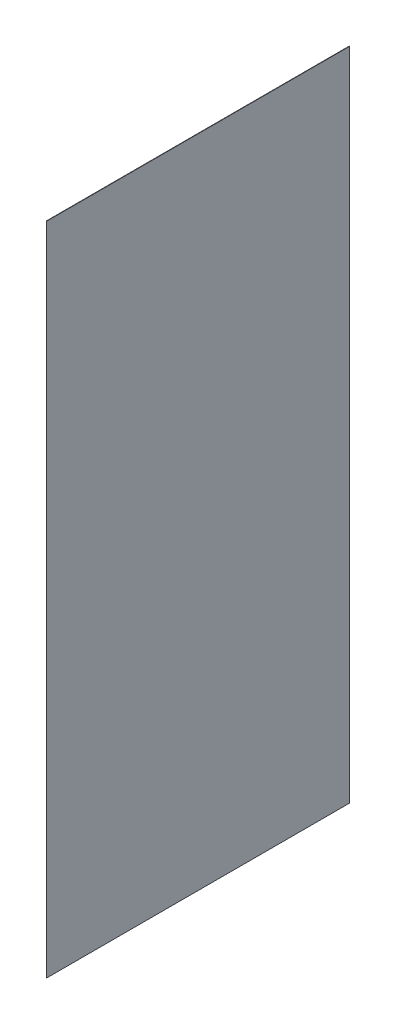
ISO-10303-21;
HEADER;
FILE_DESCRIPTION(('STEP AP214'),'2;1');
FILE_NAME('part.step','',(''),(''),'','','');
FILE_SCHEMA(('AUTOMOTIVE_DESIGN { 1 0 10303 214 1 1 1 1 }'));
ENDSEC;
DATA;
#1=APPLICATION_CONTEXT('core data for automotive mechanical design processes');
#2=APPLICATION_PROTOCOL_DEFINITION('international standard','automotive_design',2000,#1);
#3=PRODUCT_CONTEXT('',#1,'mechanical');
#4=PRODUCT('Part','Part','',(#3));
#5=PRODUCT_RELATED_PRODUCT_CATEGORY('part','',(#4));
#6=PRODUCT_DEFINITION_FORMATION('','',#4);
#7=PRODUCT_DEFINITION_CONTEXT('part definition',#1,'design');
#8=PRODUCT_DEFINITION('design','',#6,#7);
#9=PRODUCT_DEFINITION_SHAPE('','',#8);
#10=(LENGTH_UNIT() NAMED_UNIT(*) SI_UNIT(.MILLI.,.METRE.));
#11=(NAMED_UNIT(*) PLANE_ANGLE_UNIT() SI_UNIT($,.RADIAN.));
#12=(NAMED_UNIT(*) SI_UNIT($,.STERADIAN.) SOLID_ANGLE_UNIT());
#13=UNCERTAINTY_MEASURE_WITH_UNIT(LENGTH_MEASURE(1.E-05),#10,'distance_accuracy_value','');
#14=(GEOMETRIC_REPRESENTATION_CONTEXT(3) GLOBAL_UNCERTAINTY_ASSIGNED_CONTEXT((#13)) GLOBAL_UNIT_ASSIGNED_CONTEXT((#10,
#11,#12)) REPRESENTATION_CONTEXT('',''));
#15=CARTESIAN_POINT('',(0.,0.,0.));
#16=DIRECTION('',(0.,0.,1.));
#17=DIRECTION('',(1.,0.,0.));
#18=AXIS2_PLACEMENT_3D('',#15,#16,#17);
#19=CARTESIAN_POINT('',(657.5,241.5,-798.5));
#20=DIRECTION('',(-1.,0.,0.));
#21=DIRECTION('',(0.,0.,1.));
#22=AXIS2_PLACEMENT_3D('',#19,#20,#21);
#23=PLANE('',#22);
#24=DIRECTION('',(0.,-1.,0.));
#25=VECTOR('',#24,1.);
#26=CARTESIAN_POINT('',(657.5,241.5,0.));
#27=LINE('',#26,#25);
#28=CARTESIAN_POINT('',(657.5,1968.5,0.));
#29=VERTEX_POINT('',#28);
#30=CARTESIAN_POINT('',(657.5,241.5,0.));
#31=VERTEX_POINT('',#30);
#32=EDGE_CURVE('E103',#29,#31,#27,.T.);
#33=ORIENTED_EDGE('',*,*,#32,.F.);
#34=DIRECTION('',(0.,0.,1.));
#35=VECTOR('',#34,1.);
#36=CARTESIAN_POINT('',(657.5,1968.5,-798.5));
#37=LINE('',#36,#35);
#38=CARTESIAN_POINT('',(657.5,1968.5,-798.5));
#39=VERTEX_POINT('',#38);
#40=EDGE_CURVE('E11',#39,#29,#37,.T.);
#41=ORIENTED_EDGE('',*,*,#40,.F.);
#42=DIRECTION('',(0.,-1.,0.));
#43=VECTOR('',#42,1.);
#44=CARTESIAN_POINT('',(657.5,241.5,-798.5));
#45=LINE('',#44,#43);
#46=CARTESIAN_POINT('',(657.5,241.5,-798.5));
#47=VERTEX_POINT('',#46);
#48=EDGE_CURVE('E97',#39,#47,#45,.T.);
#49=ORIENTED_EDGE('',*,*,#48,.T.);
#50=DIRECTION('',(0.,0.,1.));
#51=VECTOR('',#50,1.);
#52=CARTESIAN_POINT('',(657.5,241.5,-798.5));
#53=LINE('',#52,#51);
#54=EDGE_CURVE('E42',#47,#31,#53,.T.);
#55=ORIENTED_EDGE('',*,*,#54,.T.);
#56=EDGE_LOOP('',(#33,#41,#49,#55));
#57=FACE_BOUND('',#56,.T.);
#58=ADVANCED_FACE('F39',(#57),#23,.T.);
#59=CARTESIAN_POINT('',(657.5,1968.5,-798.5));
#60=DIRECTION('',(0.,1.,0.));
#61=DIRECTION('',(0.,0.,1.));
#62=AXIS2_PLACEMENT_3D('',#59,#60,#61);
#63=PLANE('',#62);
#64=DIRECTION('',(-1.,0.,0.));
#65=VECTOR('',#64,1.);
#66=CARTESIAN_POINT('',(657.5,1968.5,0.));
#67=LINE('',#66,#65);
#68=CARTESIAN_POINT('',(658.5,1968.5,0.));
#69=VERTEX_POINT('',#68);
#70=EDGE_CURVE('E99',#69,#29,#67,.T.);
#71=ORIENTED_EDGE('',*,*,#70,.F.);
#72=DIRECTION('',(0.,0.,1.));
#73=VECTOR('',#72,1.);
#74=CARTESIAN_POINT('',(658.5,1968.5,-798.5));
#75=LINE('',#74,#73);
#76=CARTESIAN_POINT('',(658.5,1968.5,-798.5));
#77=VERTEX_POINT('',#76);
#78=EDGE_CURVE('E48',#77,#69,#75,.T.);
#79=ORIENTED_EDGE('',*,*,#78,.F.);
#80=DIRECTION('',(-1.,0.,0.));
#81=VECTOR('',#80,1.);
#82=CARTESIAN_POINT('',(657.5,1968.5,-798.5));
#83=LINE('',#82,#81);
#84=EDGE_CURVE('E94',#77,#39,#83,.T.);
#85=ORIENTED_EDGE('',*,*,#84,.T.);
#86=ORIENTED_EDGE('',*,*,#40,.T.);
#87=EDGE_LOOP('',(#71,#79,#85,#86));
#88=FACE_BOUND('',#87,.T.);
#89=ADVANCED_FACE('F113',(#88),#63,.T.);
#90=CARTESIAN_POINT('',(658.5,241.5,-798.5));
#91=DIRECTION('',(1.,0.,0.));
#92=DIRECTION('',(0.,0.,-1.));
#93=AXIS2_PLACEMENT_3D('',#90,#91,#92);
#94=PLANE('',#93);
#95=DIRECTION('',(0.,1.,0.));
#96=VECTOR('',#95,1.);
#97=CARTESIAN_POINT('',(658.5,241.5,0.));
#98=LINE('',#97,#96);
#99=CARTESIAN_POINT('',(658.5,241.5,0.));
#100=VERTEX_POINT('',#99);
#101=EDGE_CURVE('E89',#100,#69,#98,.T.);
#102=ORIENTED_EDGE('',*,*,#101,.F.);
#103=DIRECTION('',(0.,0.,1.));
#104=VECTOR('',#103,1.);
#105=CARTESIAN_POINT('',(658.5,241.5,-798.5));
#106=LINE('',#105,#104);
#107=CARTESIAN_POINT('',(658.5,241.5,-798.5));
#108=VERTEX_POINT('',#107);
#109=EDGE_CURVE('E84',#108,#100,#106,.T.);
#110=ORIENTED_EDGE('',*,*,#109,.F.);
#111=DIRECTION('',(0.,1.,0.));
#112=VECTOR('',#111,1.);
#113=CARTESIAN_POINT('',(658.5,241.5,-798.5));
#114=LINE('',#113,#112);
#115=EDGE_CURVE('E87',#108,#77,#114,.T.);
#116=ORIENTED_EDGE('',*,*,#115,.T.);
#117=ORIENTED_EDGE('',*,*,#78,.T.);
#118=EDGE_LOOP('',(#102,#110,#116,#117));
#119=FACE_BOUND('',#118,.T.);
#120=ADVANCED_FACE('F86',(#119),#94,.T.);
#121=CARTESIAN_POINT('',(657.5,241.5,-798.5));
#122=DIRECTION('',(0.,-1.,0.));
#123=DIRECTION('',(0.,0.,-1.));
#124=AXIS2_PLACEMENT_3D('',#121,#122,#123);
#125=PLANE('',#124);
#126=DIRECTION('',(1.,0.,0.));
#127=VECTOR('',#126,1.);
#128=CARTESIAN_POINT('',(657.5,241.5,0.));
#129=LINE('',#128,#127);
#130=EDGE_CURVE('E106',#31,#100,#129,.T.);
#131=ORIENTED_EDGE('',*,*,#130,.F.);
#132=ORIENTED_EDGE('',*,*,#54,.F.);
#133=DIRECTION('',(1.,0.,0.));
#134=VECTOR('',#133,1.);
#135=CARTESIAN_POINT('',(657.5,241.5,-798.5));
#136=LINE('',#135,#134);
#137=EDGE_CURVE('E93',#47,#108,#136,.T.);
#138=ORIENTED_EDGE('',*,*,#137,.T.);
#139=ORIENTED_EDGE('',*,*,#109,.T.);
#140=EDGE_LOOP('',(#131,#132,#138,#139));
#141=FACE_BOUND('',#140,.T.);
#142=ADVANCED_FACE('F96',(#141),#125,.T.);
#143=CARTESIAN_POINT('',(0.,0.,-798.5));
#144=DIRECTION('',(0.,0.,-1.));
#145=DIRECTION('',(-1.,0.,0.));
#146=AXIS2_PLACEMENT_3D('',#143,#144,#145);
#147=PLANE('',#146);
#148=ORIENTED_EDGE('',*,*,#48,.F.);
#149=ORIENTED_EDGE('',*,*,#84,.F.);
#150=ORIENTED_EDGE('',*,*,#115,.F.);
#151=ORIENTED_EDGE('',*,*,#137,.F.);
#152=EDGE_LOOP('',(#148,#149,#150,#151));
#153=FACE_BOUND('',#152,.T.);
#154=ADVANCED_FACE('F92',(#153),#147,.T.);
#155=CARTESIAN_POINT('',(0.,0.,0.));
#156=DIRECTION('',(0.,0.,-1.));
#157=DIRECTION('',(-1.,0.,0.));
#158=AXIS2_PLACEMENT_3D('',#155,#156,#157);
#159=PLANE('',#158);
#160=ORIENTED_EDGE('',*,*,#32,.T.);
#161=ORIENTED_EDGE('',*,*,#130,.T.);
#162=ORIENTED_EDGE('',*,*,#101,.T.);
#163=ORIENTED_EDGE('',*,*,#70,.T.);
#164=EDGE_LOOP('',(#160,#161,#162,#163));
#165=FACE_BOUND('',#164,.T.);
#166=ADVANCED_FACE('F112',(#165),#159,.F.);
#167=CLOSED_SHELL('',(#58,#89,#120,#142,#154,#166));
#168=MANIFOLD_SOLID_BREP('B2',#167);
#169=ADVANCED_BREP_SHAPE_REPRESENTATION('',(#18,#168),#14);
#170=SHAPE_DEFINITION_REPRESENTATION(#9,#169);
ENDSEC;
END-ISO-10303-21;
